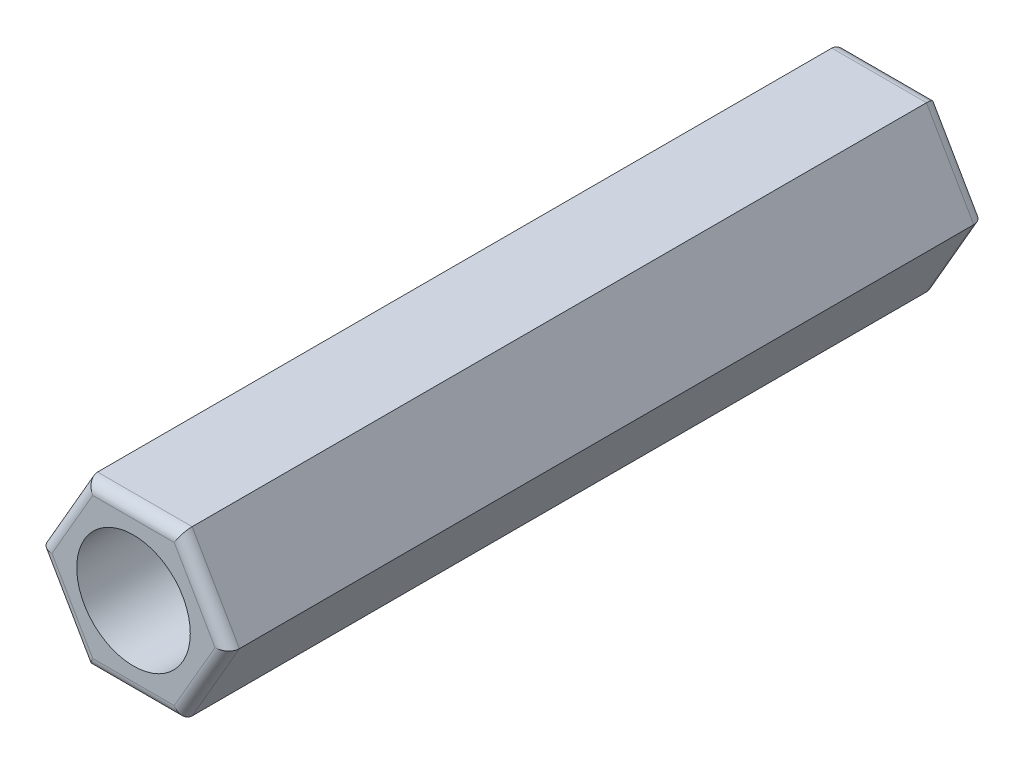
ISO-10303-21;
HEADER;
FILE_DESCRIPTION(('STEP AP214'),'2;1');
FILE_NAME('part.step','',(''),(''),'','','');
FILE_SCHEMA(('AUTOMOTIVE_DESIGN { 1 0 10303 214 1 1 1 1 }'));
ENDSEC;
DATA;
#1=APPLICATION_CONTEXT('core data for automotive mechanical design processes');
#2=APPLICATION_PROTOCOL_DEFINITION('international standard','automotive_design',2000,#1);
#3=PRODUCT_CONTEXT('',#1,'mechanical');
#4=PRODUCT('Part','Part','',(#3));
#5=PRODUCT_RELATED_PRODUCT_CATEGORY('part','',(#4));
#6=PRODUCT_DEFINITION_FORMATION('','',#4);
#7=PRODUCT_DEFINITION_CONTEXT('part definition',#1,'design');
#8=PRODUCT_DEFINITION('design','',#6,#7);
#9=PRODUCT_DEFINITION_SHAPE('','',#8);
#10=(LENGTH_UNIT() NAMED_UNIT(*) SI_UNIT(.MILLI.,.METRE.));
#11=(NAMED_UNIT(*) PLANE_ANGLE_UNIT() SI_UNIT($,.RADIAN.));
#12=(NAMED_UNIT(*) SI_UNIT($,.STERADIAN.) SOLID_ANGLE_UNIT());
#13=UNCERTAINTY_MEASURE_WITH_UNIT(LENGTH_MEASURE(1.E-05),#10,'distance_accuracy_value','');
#14=(GEOMETRIC_REPRESENTATION_CONTEXT(3) GLOBAL_UNCERTAINTY_ASSIGNED_CONTEXT((#13)) GLOBAL_UNIT_ASSIGNED_CONTEXT((#10,
#11,#12)) REPRESENTATION_CONTEXT('',''));
#15=CARTESIAN_POINT('',(0.,0.,0.));
#16=DIRECTION('',(0.,0.,1.));
#17=DIRECTION('',(1.,0.,0.));
#18=AXIS2_PLACEMENT_3D('',#15,#16,#17);
#19=CARTESIAN_POINT('',(0.,0.,20.));
#20=DIRECTION('',(0.,0.,1.));
#21=DIRECTION('',(1.,0.,0.));
#22=AXIS2_PLACEMENT_3D('',#19,#20,#21);
#23=PLANE('',#22);
#24=DIRECTION('',(1.,0.,0.));
#25=VECTOR('',#24,1.);
#26=CARTESIAN_POINT('',(1.25,-1.8650635094611,20.));
#27=LINE('',#26,#25);
#28=CARTESIAN_POINT('',(-1.07679491924311,-1.8650635094611,20.));
#29=VERTEX_POINT('',#28);
#30=CARTESIAN_POINT('',(1.07679491924311,-1.8650635094611,20.));
#31=VERTEX_POINT('',#30);
#32=EDGE_CURVE('E131',#29,#31,#27,.T.);
#33=ORIENTED_EDGE('',*,*,#32,.T.);
#34=DIRECTION('',(0.5,0.866025403784439,0.));
#35=VECTOR('',#34,1.);
#36=CARTESIAN_POINT('',(2.24019237886467,0.150000000000001,20.));
#37=LINE('',#36,#35);
#38=CARTESIAN_POINT('',(2.15358983848622,0.,20.));
#39=VERTEX_POINT('',#38);
#40=EDGE_CURVE('E163',#31,#39,#37,.T.);
#41=ORIENTED_EDGE('',*,*,#40,.T.);
#42=DIRECTION('',(-0.5,0.866025403784438,0.));
#43=VECTOR('',#42,1.);
#44=CARTESIAN_POINT('',(0.990192378864667,2.0150635094611,20.));
#45=LINE('',#44,#43);
#46=CARTESIAN_POINT('',(1.07679491924311,1.8650635094611,20.));
#47=VERTEX_POINT('',#46);
#48=EDGE_CURVE('E161',#39,#47,#45,.T.);
#49=ORIENTED_EDGE('',*,*,#48,.T.);
#50=DIRECTION('',(-1.,0.,0.));
#51=VECTOR('',#50,1.);
#52=CARTESIAN_POINT('',(-1.25,1.8650635094611,20.));
#53=LINE('',#52,#51);
#54=CARTESIAN_POINT('',(-1.07679491924311,1.8650635094611,20.));
#55=VERTEX_POINT('',#54);
#56=EDGE_CURVE('E159',#47,#55,#53,.T.);
#57=ORIENTED_EDGE('',*,*,#56,.T.);
#58=DIRECTION('',(-0.5,-0.866025403784439,0.));
#59=VECTOR('',#58,1.);
#60=CARTESIAN_POINT('',(-2.24019237886467,-0.15,20.));
#61=LINE('',#60,#59);
#62=CARTESIAN_POINT('',(-2.15358983848623,0.,20.));
#63=VERTEX_POINT('',#62);
#64=EDGE_CURVE('E134',#55,#63,#61,.T.);
#65=ORIENTED_EDGE('',*,*,#64,.T.);
#66=DIRECTION('',(0.5,-0.866025403784439,0.));
#67=VECTOR('',#66,1.);
#68=CARTESIAN_POINT('',(-0.990192378864668,-2.0150635094611,20.));
#69=LINE('',#68,#67);
#70=EDGE_CURVE('E126',#63,#29,#69,.T.);
#71=ORIENTED_EDGE('',*,*,#70,.T.);
#72=EDGE_LOOP('',(#33,#41,#49,#57,#65,#71));
#73=FACE_BOUND('',#72,.T.);
#74=CARTESIAN_POINT('',(0.,0.,20.));
#75=DIRECTION('',(0.,0.,1.));
#76=DIRECTION('',(1.,0.,0.));
#77=AXIS2_PLACEMENT_3D('',#74,#75,#76);
#78=CIRCLE('',#77,1.5);
#79=CARTESIAN_POINT('',(1.5,0.,20.));
#80=VERTEX_POINT('',#79);
#81=EDGE_CURVE('E259',#80,#80,#78,.T.);
#82=ORIENTED_EDGE('',*,*,#81,.F.);
#83=EDGE_LOOP('',(#82));
#84=FACE_BOUND('',#83,.T.);
#85=ADVANCED_FACE('F35',(#73,#84),#23,.T.);
#86=CARTESIAN_POINT('',(0.,0.,0.));
#87=DIRECTION('',(0.,0.,1.));
#88=DIRECTION('',(1.,0.,0.));
#89=AXIS2_PLACEMENT_3D('',#86,#87,#88);
#90=PLANE('',#89);
#91=DIRECTION('',(1.,0.,0.));
#92=VECTOR('',#91,1.);
#93=CARTESIAN_POINT('',(0.,-1.8650635094611,0.));
#94=LINE('',#93,#92);
#95=CARTESIAN_POINT('',(1.07679491924311,-1.8650635094611,0.));
#96=VERTEX_POINT('',#95);
#97=CARTESIAN_POINT('',(-1.07679491924311,-1.8650635094611,0.));
#98=VERTEX_POINT('',#97);
#99=EDGE_CURVE('E194',#96,#98,#94,.F.);
#100=ORIENTED_EDGE('',*,*,#99,.T.);
#101=DIRECTION('',(0.5,-0.866025403784439,0.));
#102=VECTOR('',#101,1.);
#103=CARTESIAN_POINT('',(-1.61519237886467,-0.932531754730549,0.));
#104=LINE('',#103,#102);
#105=CARTESIAN_POINT('',(-2.15358983848623,0.,0.));
#106=VERTEX_POINT('',#105);
#107=EDGE_CURVE('E201',#98,#106,#104,.F.);
#108=ORIENTED_EDGE('',*,*,#107,.T.);
#109=DIRECTION('',(-0.5,-0.866025403784439,0.));
#110=VECTOR('',#109,1.);
#111=CARTESIAN_POINT('',(-1.61519237886467,0.932531754730548,0.));
#112=LINE('',#111,#110);
#113=CARTESIAN_POINT('',(-1.07679491924311,1.8650635094611,0.));
#114=VERTEX_POINT('',#113);
#115=EDGE_CURVE('E199',#106,#114,#112,.F.);
#116=ORIENTED_EDGE('',*,*,#115,.T.);
#117=DIRECTION('',(-1.,0.,0.));
#118=VECTOR('',#117,1.);
#119=CARTESIAN_POINT('',(0.,1.8650635094611,0.));
#120=LINE('',#119,#118);
#121=CARTESIAN_POINT('',(1.07679491924311,1.8650635094611,0.));
#122=VERTEX_POINT('',#121);
#123=EDGE_CURVE('E197',#114,#122,#120,.F.);
#124=ORIENTED_EDGE('',*,*,#123,.T.);
#125=DIRECTION('',(-0.5,0.866025403784438,0.));
#126=VECTOR('',#125,1.);
#127=CARTESIAN_POINT('',(1.61519237886467,0.932531754730549,0.));
#128=LINE('',#127,#126);
#129=CARTESIAN_POINT('',(2.15358983848622,0.,0.));
#130=VERTEX_POINT('',#129);
#131=EDGE_CURVE('E192',#122,#130,#128,.F.);
#132=ORIENTED_EDGE('',*,*,#131,.T.);
#133=DIRECTION('',(0.5,0.866025403784439,0.));
#134=VECTOR('',#133,1.);
#135=CARTESIAN_POINT('',(1.61519237886467,-0.932531754730547,0.));
#136=LINE('',#135,#134);
#137=EDGE_CURVE('E190',#130,#96,#136,.F.);
#138=ORIENTED_EDGE('',*,*,#137,.T.);
#139=EDGE_LOOP('',(#100,#108,#116,#124,#132,#138));
#140=FACE_BOUND('',#139,.T.);
#141=CARTESIAN_POINT('',(0.,0.,0.));
#142=DIRECTION('',(0.,0.,1.));
#143=DIRECTION('',(1.,0.,0.));
#144=AXIS2_PLACEMENT_3D('',#141,#142,#143);
#145=CIRCLE('',#144,1.5);
#146=CARTESIAN_POINT('',(1.5,0.,0.));
#147=VERTEX_POINT('',#146);
#148=EDGE_CURVE('E187',#147,#147,#145,.T.);
#149=ORIENTED_EDGE('',*,*,#148,.T.);
#150=EDGE_LOOP('',(#149));
#151=FACE_BOUND('',#150,.T.);
#152=ADVANCED_FACE('F234',(#140,#151),#90,.F.);
#153=CARTESIAN_POINT('',(1.25,-2.1650635094611,20.));
#154=DIRECTION('',(-0.866025403784439,0.5,0.));
#155=DIRECTION('',(-0.5,-0.866025403784439,0.));
#156=AXIS2_PLACEMENT_3D('',#153,#154,#155);
#157=PLANE('',#156);
#158=DIRECTION('',(0.,0.,-1.));
#159=VECTOR('',#158,1.);
#160=CARTESIAN_POINT('',(1.25,-2.1650635094611,20.));
#161=LINE('',#160,#159);
#162=CARTESIAN_POINT('',(1.25,-2.1650635094611,19.7));
#163=VERTEX_POINT('',#162);
#164=CARTESIAN_POINT('',(1.25,-2.1650635094611,0.299999999999998));
#165=VERTEX_POINT('',#164);
#166=EDGE_CURVE('E255',#163,#165,#161,.T.);
#167=ORIENTED_EDGE('',*,*,#166,.T.);
#168=DIRECTION('',(0.5,0.866025403784439,0.));
#169=VECTOR('',#168,1.);
#170=CARTESIAN_POINT('',(1.25,-2.1650635094611,0.300000000000002));
#171=LINE('',#170,#169);
#172=CARTESIAN_POINT('',(2.5,0.,0.299999999999998));
#173=VERTEX_POINT('',#172);
#174=EDGE_CURVE('E11',#165,#173,#171,.T.);
#175=ORIENTED_EDGE('',*,*,#174,.T.);
#176=DIRECTION('',(0.,0.,-1.));
#177=VECTOR('',#176,1.);
#178=CARTESIAN_POINT('',(2.5,0.,20.));
#179=LINE('',#178,#177);
#180=CARTESIAN_POINT('',(2.5,0.,19.7));
#181=VERTEX_POINT('',#180);
#182=EDGE_CURVE('E152',#181,#173,#179,.T.);
#183=ORIENTED_EDGE('',*,*,#182,.F.);
#184=DIRECTION('',(0.5,0.866025403784439,0.));
#185=VECTOR('',#184,1.);
#186=CARTESIAN_POINT('',(1.25,-2.1650635094611,19.7));
#187=LINE('',#186,#185);
#188=EDGE_CURVE('E165',#181,#163,#187,.F.);
#189=ORIENTED_EDGE('',*,*,#188,.T.);
#190=EDGE_LOOP('',(#167,#175,#183,#189));
#191=FACE_BOUND('',#190,.T.);
#192=ADVANCED_FACE('F281',(#191),#157,.F.);
#193=CARTESIAN_POINT('',(2.5,0.,20.));
#194=DIRECTION('',(-0.866025403784438,-0.5,0.));
#195=DIRECTION('',(0.5,-0.866025403784438,0.));
#196=AXIS2_PLACEMENT_3D('',#193,#194,#195);
#197=PLANE('',#196);
#198=ORIENTED_EDGE('',*,*,#182,.T.);
#199=DIRECTION('',(-0.5,0.866025403784438,0.));
#200=VECTOR('',#199,1.);
#201=CARTESIAN_POINT('',(2.5,0.,0.300000000000002));
#202=LINE('',#201,#200);
#203=CARTESIAN_POINT('',(1.25,2.1650635094611,0.299999999999998));
#204=VERTEX_POINT('',#203);
#205=EDGE_CURVE('E57',#173,#204,#202,.T.);
#206=ORIENTED_EDGE('',*,*,#205,.T.);
#207=DIRECTION('',(0.,0.,-1.));
#208=VECTOR('',#207,1.);
#209=CARTESIAN_POINT('',(1.25,2.1650635094611,20.));
#210=LINE('',#209,#208);
#211=CARTESIAN_POINT('',(1.25,2.1650635094611,19.7));
#212=VERTEX_POINT('',#211);
#213=EDGE_CURVE('E154',#212,#204,#210,.T.);
#214=ORIENTED_EDGE('',*,*,#213,.F.);
#215=DIRECTION('',(-0.5,0.866025403784438,0.));
#216=VECTOR('',#215,1.);
#217=CARTESIAN_POINT('',(2.5,0.,19.7));
#218=LINE('',#217,#216);
#219=EDGE_CURVE('E168',#212,#181,#218,.F.);
#220=ORIENTED_EDGE('',*,*,#219,.T.);
#221=EDGE_LOOP('',(#198,#206,#214,#220));
#222=FACE_BOUND('',#221,.T.);
#223=ADVANCED_FACE('F269',(#222),#197,.F.);
#224=CARTESIAN_POINT('',(1.25,2.1650635094611,20.));
#225=DIRECTION('',(0.,-1.,0.));
#226=DIRECTION('',(0.,0.,-1.));
#227=AXIS2_PLACEMENT_3D('',#224,#225,#226);
#228=PLANE('',#227);
#229=ORIENTED_EDGE('',*,*,#213,.T.);
#230=DIRECTION('',(-1.,0.,0.));
#231=VECTOR('',#230,1.);
#232=CARTESIAN_POINT('',(1.25,2.1650635094611,0.300000000000002));
#233=LINE('',#232,#231);
#234=CARTESIAN_POINT('',(-1.25,2.1650635094611,0.299999999999998));
#235=VERTEX_POINT('',#234);
#236=EDGE_CURVE('E44',#204,#235,#233,.T.);
#237=ORIENTED_EDGE('',*,*,#236,.T.);
#238=DIRECTION('',(0.,0.,-1.));
#239=VECTOR('',#238,1.);
#240=CARTESIAN_POINT('',(-1.25,2.1650635094611,20.));
#241=LINE('',#240,#239);
#242=CARTESIAN_POINT('',(-1.25,2.1650635094611,19.7));
#243=VERTEX_POINT('',#242);
#244=EDGE_CURVE('E257',#243,#235,#241,.T.);
#245=ORIENTED_EDGE('',*,*,#244,.F.);
#246=DIRECTION('',(-1.,0.,0.));
#247=VECTOR('',#246,1.);
#248=CARTESIAN_POINT('',(1.25,2.1650635094611,19.7));
#249=LINE('',#248,#247);
#250=EDGE_CURVE('E170',#243,#212,#249,.F.);
#251=ORIENTED_EDGE('',*,*,#250,.T.);
#252=EDGE_LOOP('',(#229,#237,#245,#251));
#253=FACE_BOUND('',#252,.T.);
#254=ADVANCED_FACE('F265',(#253),#228,.F.);
#255=CARTESIAN_POINT('',(-1.25,2.1650635094611,20.));
#256=DIRECTION('',(0.866025403784439,-0.5,0.));
#257=DIRECTION('',(0.5,0.866025403784439,0.));
#258=AXIS2_PLACEMENT_3D('',#255,#256,#257);
#259=PLANE('',#258);
#260=ORIENTED_EDGE('',*,*,#244,.T.);
#261=DIRECTION('',(-0.5,-0.866025403784439,0.));
#262=VECTOR('',#261,1.);
#263=CARTESIAN_POINT('',(-1.25,2.1650635094611,0.300000000000002));
#264=LINE('',#263,#262);
#265=CARTESIAN_POINT('',(-2.5,0.,0.299999999999998));
#266=VERTEX_POINT('',#265);
#267=EDGE_CURVE('E205',#235,#266,#264,.T.);
#268=ORIENTED_EDGE('',*,*,#267,.T.);
#269=DIRECTION('',(0.,0.,-1.));
#270=VECTOR('',#269,1.);
#271=CARTESIAN_POINT('',(-2.5,0.,20.));
#272=LINE('',#271,#270);
#273=CARTESIAN_POINT('',(-2.5,0.,19.7));
#274=VERTEX_POINT('',#273);
#275=EDGE_CURVE('E251',#274,#266,#272,.T.);
#276=ORIENTED_EDGE('',*,*,#275,.F.);
#277=DIRECTION('',(-0.5,-0.866025403784439,0.));
#278=VECTOR('',#277,1.);
#279=CARTESIAN_POINT('',(-1.25,2.1650635094611,19.7));
#280=LINE('',#279,#278);
#281=EDGE_CURVE('E172',#274,#243,#280,.F.);
#282=ORIENTED_EDGE('',*,*,#281,.T.);
#283=EDGE_LOOP('',(#260,#268,#276,#282));
#284=FACE_BOUND('',#283,.T.);
#285=ADVANCED_FACE('F309',(#284),#259,.F.);
#286=CARTESIAN_POINT('',(-2.5,0.,20.));
#287=DIRECTION('',(0.866025403784439,0.5,0.));
#288=DIRECTION('',(-0.5,0.866025403784439,0.));
#289=AXIS2_PLACEMENT_3D('',#286,#287,#288);
#290=PLANE('',#289);
#291=ORIENTED_EDGE('',*,*,#275,.T.);
#292=DIRECTION('',(0.5,-0.866025403784439,0.));
#293=VECTOR('',#292,1.);
#294=CARTESIAN_POINT('',(-2.5,0.,0.300000000000002));
#295=LINE('',#294,#293);
#296=CARTESIAN_POINT('',(-1.25,-2.1650635094611,0.299999999999998));
#297=VERTEX_POINT('',#296);
#298=EDGE_CURVE('E203',#266,#297,#295,.T.);
#299=ORIENTED_EDGE('',*,*,#298,.T.);
#300=DIRECTION('',(0.,0.,-1.));
#301=VECTOR('',#300,1.);
#302=CARTESIAN_POINT('',(-1.25,-2.1650635094611,20.));
#303=LINE('',#302,#301);
#304=CARTESIAN_POINT('',(-1.25,-2.1650635094611,19.7));
#305=VERTEX_POINT('',#304);
#306=EDGE_CURVE('E249',#305,#297,#303,.T.);
#307=ORIENTED_EDGE('',*,*,#306,.F.);
#308=DIRECTION('',(0.5,-0.866025403784439,0.));
#309=VECTOR('',#308,1.);
#310=CARTESIAN_POINT('',(-2.5,0.,19.7));
#311=LINE('',#310,#309);
#312=EDGE_CURVE('E143',#305,#274,#311,.F.);
#313=ORIENTED_EDGE('',*,*,#312,.T.);
#314=EDGE_LOOP('',(#291,#299,#307,#313));
#315=FACE_BOUND('',#314,.T.);
#316=ADVANCED_FACE('F248',(#315),#290,.F.);
#317=CARTESIAN_POINT('',(-1.25,-2.1650635094611,20.));
#318=DIRECTION('',(0.,1.,0.));
#319=DIRECTION('',(-1.,0.,0.));
#320=AXIS2_PLACEMENT_3D('',#317,#318,#319);
#321=PLANE('',#320);
#322=ORIENTED_EDGE('',*,*,#306,.T.);
#323=DIRECTION('',(1.,0.,0.));
#324=VECTOR('',#323,1.);
#325=CARTESIAN_POINT('',(-1.25,-2.1650635094611,0.300000000000002));
#326=LINE('',#325,#324);
#327=EDGE_CURVE('E177',#297,#165,#326,.T.);
#328=ORIENTED_EDGE('',*,*,#327,.T.);
#329=ORIENTED_EDGE('',*,*,#166,.F.);
#330=DIRECTION('',(1.,0.,0.));
#331=VECTOR('',#330,1.);
#332=CARTESIAN_POINT('',(-1.25,-2.1650635094611,19.7));
#333=LINE('',#332,#331);
#334=EDGE_CURVE('E175',#163,#305,#333,.F.);
#335=ORIENTED_EDGE('',*,*,#334,.T.);
#336=EDGE_LOOP('',(#322,#328,#329,#335));
#337=FACE_BOUND('',#336,.T.);
#338=ADVANCED_FACE('F253',(#337),#321,.F.);
#339=CARTESIAN_POINT('',(0.,0.,20.));
#340=DIRECTION('',(0.,0.,-1.));
#341=DIRECTION('',(-1.,0.,0.));
#342=AXIS2_PLACEMENT_3D('',#339,#340,#341);
#343=CYLINDRICAL_SURFACE('',#342,1.5);
#344=ORIENTED_EDGE('',*,*,#81,.T.);
#345=EDGE_LOOP('',(#344));
#346=FACE_BOUND('',#345,.T.);
#347=ORIENTED_EDGE('',*,*,#148,.F.);
#348=EDGE_LOOP('',(#347));
#349=FACE_BOUND('',#348,.T.);
#350=ADVANCED_FACE('F303',(#346,#349),#343,.F.);
#351=CARTESIAN_POINT('',(-1.61519237886467,0.932531754730548,19.7));
#352=DIRECTION('',(0.5,0.866025403784439,0.));
#353=DIRECTION('',(-0.866025403784439,0.5,0.));
#354=AXIS2_PLACEMENT_3D('',#351,#352,#353);
#355=CYLINDRICAL_SURFACE('',#354,0.3);
#356=CARTESIAN_POINT('',(-1.07679491924311,1.8650635094611,19.7));
#357=DIRECTION('',(0.866025403784439,0.5,0.));
#358=DIRECTION('',(-0.5,0.866025403784439,0.));
#359=AXIS2_PLACEMENT_3D('',#356,#357,#358);
#360=ELLIPSE('',#359,0.346410161513775,0.3);
#361=EDGE_CURVE('E146',#243,#55,#360,.T.);
#362=ORIENTED_EDGE('',*,*,#361,.F.);
#363=ORIENTED_EDGE('',*,*,#281,.F.);
#364=CARTESIAN_POINT('',(-2.15358983848623,0.,19.7));
#365=DIRECTION('',(0.,1.,0.));
#366=DIRECTION('',(-1.,0.,0.));
#367=AXIS2_PLACEMENT_3D('',#364,#365,#366);
#368=ELLIPSE('',#367,0.346410161513775,0.3);
#369=EDGE_CURVE('E185',#63,#274,#368,.F.);
#370=ORIENTED_EDGE('',*,*,#369,.F.);
#371=ORIENTED_EDGE('',*,*,#64,.F.);
#372=EDGE_LOOP('',(#362,#363,#370,#371));
#373=FACE_BOUND('',#372,.T.);
#374=ADVANCED_FACE('F328',(#373),#355,.T.);
#375=CARTESIAN_POINT('',(-1.61519237886467,-0.932531754730549,19.7));
#376=DIRECTION('',(-0.5,0.866025403784439,0.));
#377=DIRECTION('',(-0.866025403784439,-0.5,0.));
#378=AXIS2_PLACEMENT_3D('',#375,#376,#377);
#379=CYLINDRICAL_SURFACE('',#378,0.3);
#380=ORIENTED_EDGE('',*,*,#369,.T.);
#381=ORIENTED_EDGE('',*,*,#312,.F.);
#382=CARTESIAN_POINT('',(-1.07679491924311,-1.8650635094611,19.7));
#383=DIRECTION('',(-0.866025403784439,0.5,0.));
#384=DIRECTION('',(-0.5,-0.866025403784439,0.));
#385=AXIS2_PLACEMENT_3D('',#382,#383,#384);
#386=ELLIPSE('',#385,0.346410161513775,0.3);
#387=EDGE_CURVE('E141',#29,#305,#386,.F.);
#388=ORIENTED_EDGE('',*,*,#387,.F.);
#389=ORIENTED_EDGE('',*,*,#70,.F.);
#390=EDGE_LOOP('',(#380,#381,#388,#389));
#391=FACE_BOUND('',#390,.T.);
#392=ADVANCED_FACE('F142',(#391),#379,.T.);
#393=CARTESIAN_POINT('',(0.,1.8650635094611,19.7));
#394=DIRECTION('',(1.,0.,0.));
#395=DIRECTION('',(0.,0.,-1.));
#396=AXIS2_PLACEMENT_3D('',#393,#394,#395);
#397=CYLINDRICAL_SURFACE('',#396,0.3);
#398=ORIENTED_EDGE('',*,*,#361,.T.);
#399=ORIENTED_EDGE('',*,*,#56,.F.);
#400=CARTESIAN_POINT('',(1.07679491924311,1.8650635094611,19.7));
#401=DIRECTION('',(0.866025403784439,-0.5,0.));
#402=DIRECTION('',(0.5,0.866025403784439,0.));
#403=AXIS2_PLACEMENT_3D('',#400,#401,#402);
#404=ELLIPSE('',#403,0.346410161513775,0.3);
#405=EDGE_CURVE('E147',#212,#47,#404,.T.);
#406=ORIENTED_EDGE('',*,*,#405,.F.);
#407=ORIENTED_EDGE('',*,*,#250,.F.);
#408=EDGE_LOOP('',(#398,#399,#406,#407));
#409=FACE_BOUND('',#408,.T.);
#410=ADVANCED_FACE('F273',(#409),#397,.T.);
#411=CARTESIAN_POINT('',(0.,-1.8650635094611,19.7));
#412=DIRECTION('',(-1.,0.,0.));
#413=DIRECTION('',(0.,-1.,0.));
#414=AXIS2_PLACEMENT_3D('',#411,#412,#413);
#415=CYLINDRICAL_SURFACE('',#414,0.3);
#416=ORIENTED_EDGE('',*,*,#387,.T.);
#417=ORIENTED_EDGE('',*,*,#334,.F.);
#418=CARTESIAN_POINT('',(1.07679491924311,-1.8650635094611,19.7));
#419=DIRECTION('',(-0.866025403784438,-0.5,0.));
#420=DIRECTION('',(-0.5,0.866025403784439,0.));
#421=AXIS2_PLACEMENT_3D('',#418,#419,#420);
#422=ELLIPSE('',#421,0.346410161513776,0.3);
#423=EDGE_CURVE('E150',#31,#163,#422,.F.);
#424=ORIENTED_EDGE('',*,*,#423,.F.);
#425=ORIENTED_EDGE('',*,*,#32,.F.);
#426=EDGE_LOOP('',(#416,#417,#424,#425));
#427=FACE_BOUND('',#426,.T.);
#428=ADVANCED_FACE('F149',(#427),#415,.T.);
#429=CARTESIAN_POINT('',(1.61519237886467,0.932531754730549,19.7));
#430=DIRECTION('',(0.5,-0.866025403784438,0.));
#431=DIRECTION('',(0.866025403784438,0.5,0.));
#432=AXIS2_PLACEMENT_3D('',#429,#430,#431);
#433=CYLINDRICAL_SURFACE('',#432,0.3);
#434=ORIENTED_EDGE('',*,*,#405,.T.);
#435=ORIENTED_EDGE('',*,*,#48,.F.);
#436=CARTESIAN_POINT('',(2.15358983848622,0.,19.7));
#437=DIRECTION('',(0.,-1.,0.));
#438=DIRECTION('',(1.,0.,0.));
#439=AXIS2_PLACEMENT_3D('',#436,#437,#438);
#440=ELLIPSE('',#439,0.346410161513775,0.3);
#441=EDGE_CURVE('E178',#181,#39,#440,.T.);
#442=ORIENTED_EDGE('',*,*,#441,.F.);
#443=ORIENTED_EDGE('',*,*,#219,.F.);
#444=EDGE_LOOP('',(#434,#435,#442,#443));
#445=FACE_BOUND('',#444,.T.);
#446=ADVANCED_FACE('F277',(#445),#433,.T.);
#447=CARTESIAN_POINT('',(1.61519237886467,-0.932531754730547,19.7));
#448=DIRECTION('',(-0.5,-0.866025403784439,0.));
#449=DIRECTION('',(0.866025403784439,-0.5,0.));
#450=AXIS2_PLACEMENT_3D('',#447,#448,#449);
#451=CYLINDRICAL_SURFACE('',#450,0.3);
#452=ORIENTED_EDGE('',*,*,#423,.T.);
#453=ORIENTED_EDGE('',*,*,#188,.F.);
#454=ORIENTED_EDGE('',*,*,#441,.T.);
#455=ORIENTED_EDGE('',*,*,#40,.F.);
#456=EDGE_LOOP('',(#452,#453,#454,#455));
#457=FACE_BOUND('',#456,.T.);
#458=ADVANCED_FACE('F280',(#457),#451,.T.);
#459=CARTESIAN_POINT('',(1.25,1.8650635094611,0.300000000000002));
#460=DIRECTION('',(-1.,0.,0.));
#461=DIRECTION('',(0.,0.,1.));
#462=AXIS2_PLACEMENT_3D('',#459,#460,#461);
#463=CYLINDRICAL_SURFACE('',#462,0.3);
#464=CARTESIAN_POINT('',(1.07679491924311,1.8650635094611,0.300000000000002));
#465=DIRECTION('',(-0.866025403784439,0.5,0.));
#466=DIRECTION('',(-0.5,-0.866025403784439,0.));
#467=AXIS2_PLACEMENT_3D('',#464,#465,#466);
#468=ELLIPSE('',#467,0.346410161513775,0.3);
#469=EDGE_CURVE('E218',#122,#204,#468,.F.);
#470=ORIENTED_EDGE('',*,*,#469,.F.);
#471=ORIENTED_EDGE('',*,*,#123,.F.);
#472=CARTESIAN_POINT('',(-1.07679491924311,1.8650635094611,0.300000000000002));
#473=DIRECTION('',(-0.866025403784439,-0.5,0.));
#474=DIRECTION('',(-0.5,0.866025403784439,0.));
#475=AXIS2_PLACEMENT_3D('',#472,#473,#474);
#476=ELLIPSE('',#475,0.346410161513775,0.3);
#477=EDGE_CURVE('E39',#235,#114,#476,.T.);
#478=ORIENTED_EDGE('',*,*,#477,.F.);
#479=ORIENTED_EDGE('',*,*,#236,.F.);
#480=EDGE_LOOP('',(#470,#471,#478,#479));
#481=FACE_BOUND('',#480,.T.);
#482=ADVANCED_FACE('F37',(#481),#463,.T.);
#483=CARTESIAN_POINT('',(-0.990192378864669,2.0150635094611,0.300000000000002));
#484=DIRECTION('',(-0.5,-0.866025403784439,0.));
#485=DIRECTION('',(0.866025403784439,-0.5,0.));
#486=AXIS2_PLACEMENT_3D('',#483,#484,#485);
#487=CYLINDRICAL_SURFACE('',#486,0.3);
#488=ORIENTED_EDGE('',*,*,#477,.T.);
#489=ORIENTED_EDGE('',*,*,#115,.F.);
#490=CARTESIAN_POINT('',(-2.15358983848623,0.,0.300000000000002));
#491=DIRECTION('',(0.,-1.,0.));
#492=DIRECTION('',(-1.,0.,0.));
#493=AXIS2_PLACEMENT_3D('',#490,#491,#492);
#494=ELLIPSE('',#493,0.346410161513775,0.3);
#495=EDGE_CURVE('E216',#266,#106,#494,.T.);
#496=ORIENTED_EDGE('',*,*,#495,.F.);
#497=ORIENTED_EDGE('',*,*,#267,.F.);
#498=EDGE_LOOP('',(#488,#489,#496,#497));
#499=FACE_BOUND('',#498,.T.);
#500=ADVANCED_FACE('F228',(#499),#487,.T.);
#501=CARTESIAN_POINT('',(2.24019237886467,-0.149999999999999,0.300000000000002));
#502=DIRECTION('',(-0.5,0.866025403784438,0.));
#503=DIRECTION('',(-0.866025403784438,-0.5,0.));
#504=AXIS2_PLACEMENT_3D('',#501,#502,#503);
#505=CYLINDRICAL_SURFACE('',#504,0.3);
#506=ORIENTED_EDGE('',*,*,#469,.T.);
#507=ORIENTED_EDGE('',*,*,#205,.F.);
#508=CARTESIAN_POINT('',(2.15358983848622,0.,0.300000000000002));
#509=DIRECTION('',(0.,1.,0.));
#510=DIRECTION('',(1.,0.,0.));
#511=AXIS2_PLACEMENT_3D('',#508,#509,#510);
#512=ELLIPSE('',#511,0.346410161513775,0.3);
#513=EDGE_CURVE('E213',#130,#173,#512,.F.);
#514=ORIENTED_EDGE('',*,*,#513,.F.);
#515=ORIENTED_EDGE('',*,*,#131,.F.);
#516=EDGE_LOOP('',(#506,#507,#514,#515));
#517=FACE_BOUND('',#516,.T.);
#518=ADVANCED_FACE('F282',(#517),#505,.T.);
#519=CARTESIAN_POINT('',(-2.24019237886467,0.15,0.300000000000002));
#520=DIRECTION('',(0.5,-0.866025403784439,0.));
#521=DIRECTION('',(0.866025403784439,0.5,0.));
#522=AXIS2_PLACEMENT_3D('',#519,#520,#521);
#523=CYLINDRICAL_SURFACE('',#522,0.3);
#524=ORIENTED_EDGE('',*,*,#495,.T.);
#525=ORIENTED_EDGE('',*,*,#107,.F.);
#526=CARTESIAN_POINT('',(-1.07679491924311,-1.8650635094611,0.300000000000002));
#527=DIRECTION('',(0.866025403784439,-0.5,0.));
#528=DIRECTION('',(-0.5,-0.866025403784439,0.));
#529=AXIS2_PLACEMENT_3D('',#526,#527,#528);
#530=ELLIPSE('',#529,0.346410161513775,0.3);
#531=EDGE_CURVE('E211',#297,#98,#530,.T.);
#532=ORIENTED_EDGE('',*,*,#531,.F.);
#533=ORIENTED_EDGE('',*,*,#298,.F.);
#534=EDGE_LOOP('',(#524,#525,#532,#533));
#535=FACE_BOUND('',#534,.T.);
#536=ADVANCED_FACE('F241',(#535),#523,.T.);
#537=CARTESIAN_POINT('',(0.990192378864668,-2.0150635094611,0.300000000000002));
#538=DIRECTION('',(0.5,0.866025403784439,0.));
#539=DIRECTION('',(-0.866025403784439,0.5,0.));
#540=AXIS2_PLACEMENT_3D('',#537,#538,#539);
#541=CYLINDRICAL_SURFACE('',#540,0.3);
#542=ORIENTED_EDGE('',*,*,#513,.T.);
#543=ORIENTED_EDGE('',*,*,#174,.F.);
#544=CARTESIAN_POINT('',(1.07679491924311,-1.8650635094611,0.300000000000002));
#545=DIRECTION('',(0.866025403784438,0.5,0.));
#546=DIRECTION('',(-0.5,0.866025403784439,0.));
#547=AXIS2_PLACEMENT_3D('',#544,#545,#546);
#548=ELLIPSE('',#547,0.346410161513776,0.3);
#549=EDGE_CURVE('E209',#96,#165,#548,.F.);
#550=ORIENTED_EDGE('',*,*,#549,.F.);
#551=ORIENTED_EDGE('',*,*,#137,.F.);
#552=EDGE_LOOP('',(#542,#543,#550,#551));
#553=FACE_BOUND('',#552,.T.);
#554=ADVANCED_FACE('F285',(#553),#541,.T.);
#555=CARTESIAN_POINT('',(-1.25,-1.8650635094611,0.300000000000002));
#556=DIRECTION('',(1.,0.,0.));
#557=DIRECTION('',(0.,1.,0.));
#558=AXIS2_PLACEMENT_3D('',#555,#556,#557);
#559=CYLINDRICAL_SURFACE('',#558,0.3);
#560=ORIENTED_EDGE('',*,*,#531,.T.);
#561=ORIENTED_EDGE('',*,*,#99,.F.);
#562=ORIENTED_EDGE('',*,*,#549,.T.);
#563=ORIENTED_EDGE('',*,*,#327,.F.);
#564=EDGE_LOOP('',(#560,#561,#562,#563));
#565=FACE_BOUND('',#564,.T.);
#566=ADVANCED_FACE('F288',(#565),#559,.T.);
#567=CLOSED_SHELL('',(#85,#152,#192,#223,#254,#285,#316,#338,#350,#374,#392,#410,#428,#446,#458,
#482,#500,#518,#536,#554,#566));
#568=MANIFOLD_SOLID_BREP('B2',#567);
#569=ADVANCED_BREP_SHAPE_REPRESENTATION('',(#18,#568),#14);
#570=SHAPE_DEFINITION_REPRESENTATION(#9,#569);
ENDSEC;
END-ISO-10303-21;
